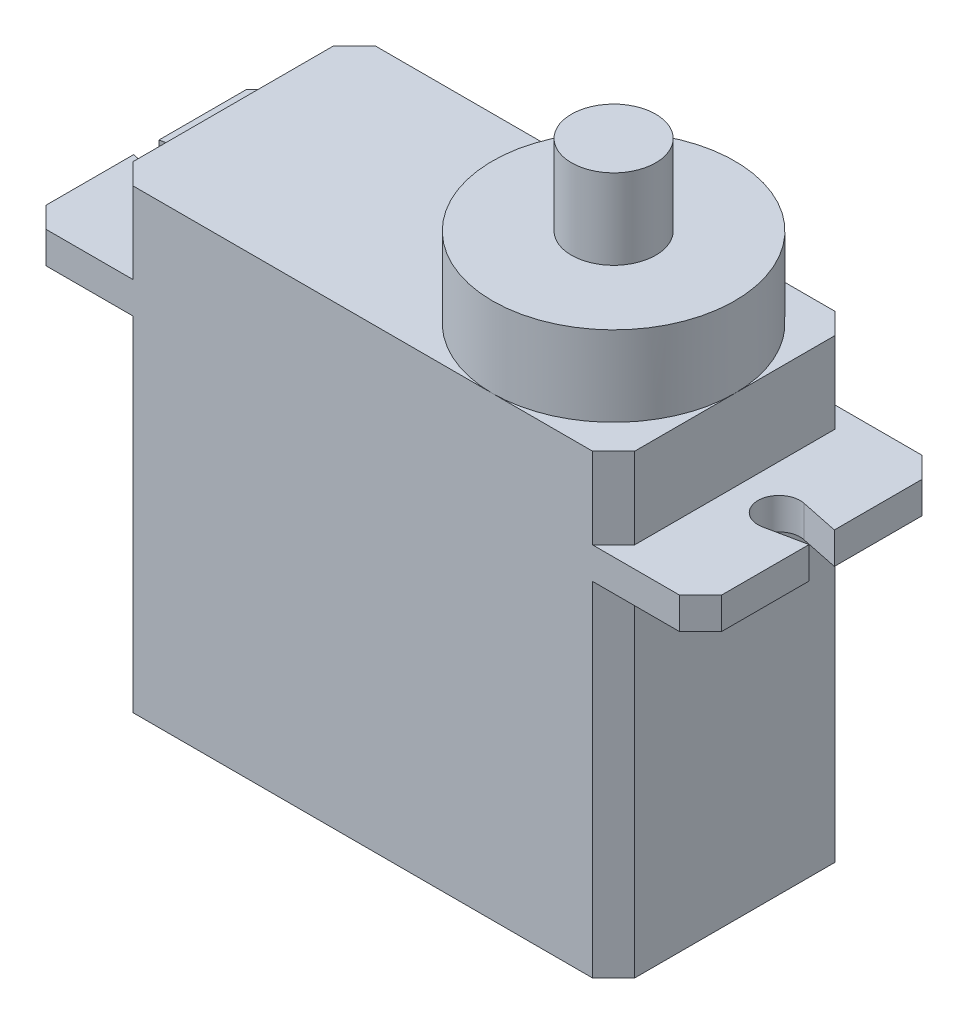
ISO-10303-21;
HEADER;
FILE_DESCRIPTION(('STEP AP214'),'2;1');
FILE_NAME('part.step','',(''),(''),'','','');
FILE_SCHEMA(('AUTOMOTIVE_DESIGN { 1 0 10303 214 1 1 1 1 }'));
ENDSEC;
DATA;
#1=APPLICATION_CONTEXT('core data for automotive mechanical design processes');
#2=APPLICATION_PROTOCOL_DEFINITION('international standard','automotive_design',2000,#1);
#3=PRODUCT_CONTEXT('',#1,'mechanical');
#4=PRODUCT('Part','Part','',(#3));
#5=PRODUCT_RELATED_PRODUCT_CATEGORY('part','',(#4));
#6=PRODUCT_DEFINITION_FORMATION('','',#4);
#7=PRODUCT_DEFINITION_CONTEXT('part definition',#1,'design');
#8=PRODUCT_DEFINITION('design','',#6,#7);
#9=PRODUCT_DEFINITION_SHAPE('','',#8);
#10=(LENGTH_UNIT() NAMED_UNIT(*) SI_UNIT(.MILLI.,.METRE.));
#11=(NAMED_UNIT(*) PLANE_ANGLE_UNIT() SI_UNIT($,.RADIAN.));
#12=(NAMED_UNIT(*) SI_UNIT($,.STERADIAN.) SOLID_ANGLE_UNIT());
#13=UNCERTAINTY_MEASURE_WITH_UNIT(LENGTH_MEASURE(1.E-05),#10,'distance_accuracy_value','');
#14=(GEOMETRIC_REPRESENTATION_CONTEXT(3) GLOBAL_UNCERTAINTY_ASSIGNED_CONTEXT((#13)) GLOBAL_UNIT_ASSIGNED_CONTEXT((#10,
#11,#12)) REPRESENTATION_CONTEXT('',''));
#15=CARTESIAN_POINT('',(0.,0.,0.));
#16=DIRECTION('',(0.,0.,1.));
#17=DIRECTION('',(1.,0.,0.));
#18=AXIS2_PLACEMENT_3D('',#15,#16,#17);
#19=CARTESIAN_POINT('',(-10.9,21.65,-5.75));
#20=DIRECTION('',(0.707106781186547,0.,0.707106781186548));
#21=DIRECTION('',(0.707106781186548,0.,-0.707106781186547));
#22=AXIS2_PLACEMENT_3D('',#19,#20,#21);
#23=PLANE('',#22);
#24=DIRECTION('',(-0.707106781186548,0.,0.707106781186547));
#25=VECTOR('',#24,1.);
#26=CARTESIAN_POINT('',(-8.32499999999999,16.3,-8.325));
#27=LINE('',#26,#25);
#28=CARTESIAN_POINT('',(-10.9,16.3,-5.75));
#29=VERTEX_POINT('',#28);
#30=CARTESIAN_POINT('',(-11.9,16.3,-4.75));
#31=VERTEX_POINT('',#30);
#32=EDGE_CURVE('E324',#29,#31,#27,.T.);
#33=ORIENTED_EDGE('',*,*,#32,.F.);
#34=DIRECTION('',(0.,-1.,0.));
#35=VECTOR('',#34,1.);
#36=CARTESIAN_POINT('',(-10.9,21.65,-5.75));
#37=LINE('',#36,#35);
#38=CARTESIAN_POINT('',(-10.9,0.,-5.75));
#39=VERTEX_POINT('',#38);
#40=EDGE_CURVE('E462',#29,#39,#37,.T.);
#41=ORIENTED_EDGE('',*,*,#40,.T.);
#42=DIRECTION('',(-0.707106781186548,0.,0.707106781186547));
#43=VECTOR('',#42,1.);
#44=CARTESIAN_POINT('',(-10.9,0.,-5.75));
#45=LINE('',#44,#43);
#46=CARTESIAN_POINT('',(-11.9,0.,-4.75));
#47=VERTEX_POINT('',#46);
#48=EDGE_CURVE('E463',#39,#47,#45,.T.);
#49=ORIENTED_EDGE('',*,*,#48,.T.);
#50=DIRECTION('',(0.,-1.,0.));
#51=VECTOR('',#50,1.);
#52=CARTESIAN_POINT('',(-11.9,21.65,-4.75));
#53=LINE('',#52,#51);
#54=EDGE_CURVE('E42',#31,#47,#53,.T.);
#55=ORIENTED_EDGE('',*,*,#54,.F.);
#56=EDGE_LOOP('',(#33,#41,#49,#55));
#57=FACE_BOUND('',#56,.T.);
#58=ADVANCED_FACE('F33',(#57),#23,.F.);
#59=CARTESIAN_POINT('',(-11.9,21.65,-4.75));
#60=DIRECTION('',(1.,0.,0.));
#61=DIRECTION('',(0.,0.,-1.));
#62=AXIS2_PLACEMENT_3D('',#59,#60,#61);
#63=PLANE('',#62);
#64=DIRECTION('',(0.,0.,1.));
#65=VECTOR('',#64,1.);
#66=CARTESIAN_POINT('',(-11.9,16.3,0.));
#67=LINE('',#66,#65);
#68=CARTESIAN_POINT('',(-11.9,16.3,4.75));
#69=VERTEX_POINT('',#68);
#70=EDGE_CURVE('E49',#31,#69,#67,.T.);
#71=ORIENTED_EDGE('',*,*,#70,.F.);
#72=ORIENTED_EDGE('',*,*,#54,.T.);
#73=DIRECTION('',(0.,0.,1.));
#74=VECTOR('',#73,1.);
#75=CARTESIAN_POINT('',(-11.9,0.,-4.75));
#76=LINE('',#75,#74);
#77=CARTESIAN_POINT('',(-11.9,0.,4.75));
#78=VERTEX_POINT('',#77);
#79=EDGE_CURVE('E466',#47,#78,#76,.T.);
#80=ORIENTED_EDGE('',*,*,#79,.T.);
#81=DIRECTION('',(0.,-1.,0.));
#82=VECTOR('',#81,1.);
#83=CARTESIAN_POINT('',(-11.9,21.65,4.75));
#84=LINE('',#83,#82);
#85=EDGE_CURVE('E508',#69,#78,#84,.T.);
#86=ORIENTED_EDGE('',*,*,#85,.F.);
#87=EDGE_LOOP('',(#71,#72,#80,#86));
#88=FACE_BOUND('',#87,.T.);
#89=ADVANCED_FACE('F520',(#88),#63,.F.);
#90=CARTESIAN_POINT('',(-11.9,21.65,4.75));
#91=DIRECTION('',(0.707106781186547,0.,-0.707106781186548));
#92=DIRECTION('',(-0.707106781186548,0.,-0.707106781186547));
#93=AXIS2_PLACEMENT_3D('',#90,#91,#92);
#94=PLANE('',#93);
#95=DIRECTION('',(0.707106781186548,0.,0.707106781186547));
#96=VECTOR('',#95,1.);
#97=CARTESIAN_POINT('',(-8.325,16.3,8.325));
#98=LINE('',#97,#96);
#99=CARTESIAN_POINT('',(-10.9,16.3,5.75));
#100=VERTEX_POINT('',#99);
#101=EDGE_CURVE('E320',#69,#100,#98,.T.);
#102=ORIENTED_EDGE('',*,*,#101,.F.);
#103=ORIENTED_EDGE('',*,*,#85,.T.);
#104=DIRECTION('',(0.707106781186548,0.,0.707106781186547));
#105=VECTOR('',#104,1.);
#106=CARTESIAN_POINT('',(-11.9,0.,4.75));
#107=LINE('',#106,#105);
#108=CARTESIAN_POINT('',(-10.9,0.,5.75));
#109=VERTEX_POINT('',#108);
#110=EDGE_CURVE('E469',#78,#109,#107,.T.);
#111=ORIENTED_EDGE('',*,*,#110,.T.);
#112=DIRECTION('',(0.,-1.,0.));
#113=VECTOR('',#112,1.);
#114=CARTESIAN_POINT('',(-10.9,21.65,5.75));
#115=LINE('',#114,#113);
#116=EDGE_CURVE('E504',#100,#109,#115,.T.);
#117=ORIENTED_EDGE('',*,*,#116,.F.);
#118=EDGE_LOOP('',(#102,#103,#111,#117));
#119=FACE_BOUND('',#118,.T.);
#120=ADVANCED_FACE('F516',(#119),#94,.F.);
#121=CARTESIAN_POINT('',(11.9,21.65,4.75));
#122=DIRECTION('',(0.707106781186547,0.,0.707106781186548));
#123=DIRECTION('',(0.707106781186548,0.,-0.707106781186547));
#124=AXIS2_PLACEMENT_3D('',#121,#122,#123);
#125=PLANE('',#124);
#126=DIRECTION('',(0.,-1.,0.));
#127=VECTOR('',#126,1.);
#128=CARTESIAN_POINT('',(11.9,21.65,4.75));
#129=LINE('',#128,#127);
#130=CARTESIAN_POINT('',(11.9,16.3,4.75));
#131=VERTEX_POINT('',#130);
#132=CARTESIAN_POINT('',(11.9,0.,4.75));
#133=VERTEX_POINT('',#132);
#134=EDGE_CURVE('E496',#131,#133,#129,.T.);
#135=ORIENTED_EDGE('',*,*,#134,.F.);
#136=DIRECTION('',(-0.707106781186548,0.,0.707106781186547));
#137=VECTOR('',#136,1.);
#138=CARTESIAN_POINT('',(8.325,16.3,8.32500000000001));
#139=LINE('',#138,#137);
#140=CARTESIAN_POINT('',(10.9,16.3,5.75));
#141=VERTEX_POINT('',#140);
#142=EDGE_CURVE('E395',#131,#141,#139,.T.);
#143=ORIENTED_EDGE('',*,*,#142,.T.);
#144=DIRECTION('',(0.,-1.,0.));
#145=VECTOR('',#144,1.);
#146=CARTESIAN_POINT('',(10.9,21.65,5.75));
#147=LINE('',#146,#145);
#148=CARTESIAN_POINT('',(10.9,0.,5.75));
#149=VERTEX_POINT('',#148);
#150=EDGE_CURVE('E500',#141,#149,#147,.T.);
#151=ORIENTED_EDGE('',*,*,#150,.T.);
#152=DIRECTION('',(-0.707106781186548,0.,0.707106781186547));
#153=VECTOR('',#152,1.);
#154=CARTESIAN_POINT('',(11.9,0.,4.75));
#155=LINE('',#154,#153);
#156=EDGE_CURVE('E475',#133,#149,#155,.T.);
#157=ORIENTED_EDGE('',*,*,#156,.F.);
#158=EDGE_LOOP('',(#135,#143,#151,#157));
#159=FACE_BOUND('',#158,.T.);
#160=ADVANCED_FACE('F549',(#159),#125,.T.);
#161=CARTESIAN_POINT('',(11.9,21.65,-4.75));
#162=DIRECTION('',(1.,0.,0.));
#163=DIRECTION('',(0.,0.,-1.));
#164=AXIS2_PLACEMENT_3D('',#161,#162,#163);
#165=PLANE('',#164);
#166=DIRECTION('',(0.,-1.,0.));
#167=VECTOR('',#166,1.);
#168=CARTESIAN_POINT('',(11.9,21.65,-4.75));
#169=LINE('',#168,#167);
#170=CARTESIAN_POINT('',(11.9,16.3,-4.75));
#171=VERTEX_POINT('',#170);
#172=CARTESIAN_POINT('',(11.9,0.,-4.75));
#173=VERTEX_POINT('',#172);
#174=EDGE_CURVE('E492',#171,#173,#169,.T.);
#175=ORIENTED_EDGE('',*,*,#174,.F.);
#176=DIRECTION('',(0.,0.,1.));
#177=VECTOR('',#176,1.);
#178=CARTESIAN_POINT('',(11.9,16.3,0.));
#179=LINE('',#178,#177);
#180=EDGE_CURVE('E392',#171,#131,#179,.T.);
#181=ORIENTED_EDGE('',*,*,#180,.T.);
#182=ORIENTED_EDGE('',*,*,#134,.T.);
#183=DIRECTION('',(0.,0.,1.));
#184=VECTOR('',#183,1.);
#185=CARTESIAN_POINT('',(11.9,0.,-4.75));
#186=LINE('',#185,#184);
#187=EDGE_CURVE('E478',#173,#133,#186,.T.);
#188=ORIENTED_EDGE('',*,*,#187,.F.);
#189=EDGE_LOOP('',(#175,#181,#182,#188));
#190=FACE_BOUND('',#189,.T.);
#191=ADVANCED_FACE('F553',(#190),#165,.T.);
#192=CARTESIAN_POINT('',(10.9,21.65,-5.75));
#193=DIRECTION('',(0.707106781186547,0.,-0.707106781186548));
#194=DIRECTION('',(-0.707106781186548,0.,-0.707106781186547));
#195=AXIS2_PLACEMENT_3D('',#192,#193,#194);
#196=PLANE('',#195);
#197=DIRECTION('',(0.,-1.,0.));
#198=VECTOR('',#197,1.);
#199=CARTESIAN_POINT('',(10.9,21.65,-5.75));
#200=LINE('',#199,#198);
#201=CARTESIAN_POINT('',(10.9,16.3,-5.75));
#202=VERTEX_POINT('',#201);
#203=CARTESIAN_POINT('',(10.9,0.,-5.75));
#204=VERTEX_POINT('',#203);
#205=EDGE_CURVE('E488',#202,#204,#200,.T.);
#206=ORIENTED_EDGE('',*,*,#205,.F.);
#207=DIRECTION('',(0.707106781186548,0.,0.707106781186547));
#208=VECTOR('',#207,1.);
#209=CARTESIAN_POINT('',(8.325,16.3,-8.325));
#210=LINE('',#209,#208);
#211=EDGE_CURVE('E389',#202,#171,#210,.T.);
#212=ORIENTED_EDGE('',*,*,#211,.T.);
#213=ORIENTED_EDGE('',*,*,#174,.T.);
#214=DIRECTION('',(0.707106781186548,0.,0.707106781186547));
#215=VECTOR('',#214,1.);
#216=CARTESIAN_POINT('',(10.9,0.,-5.75));
#217=LINE('',#216,#215);
#218=EDGE_CURVE('E481',#204,#173,#217,.T.);
#219=ORIENTED_EDGE('',*,*,#218,.F.);
#220=EDGE_LOOP('',(#206,#212,#213,#219));
#221=FACE_BOUND('',#220,.T.);
#222=ADVANCED_FACE('F543',(#221),#196,.T.);
#223=CARTESIAN_POINT('',(0.,21.65,0.));
#224=DIRECTION('',(0.,1.,0.));
#225=DIRECTION('',(0.,0.,1.));
#226=AXIS2_PLACEMENT_3D('',#223,#224,#225);
#227=PLANE('',#226);
#228=DIRECTION('',(1.,0.,0.));
#229=VECTOR('',#228,1.);
#230=CARTESIAN_POINT('',(-10.9,21.65,5.75));
#231=LINE('',#230,#229);
#232=CARTESIAN_POINT('',(-10.9,21.65,5.75));
#233=VERTEX_POINT('',#232);
#234=CARTESIAN_POINT('',(6.15,21.65,5.75));
#235=VERTEX_POINT('',#234);
#236=EDGE_CURVE('E445',#233,#235,#231,.T.);
#237=ORIENTED_EDGE('',*,*,#236,.T.);
#238=CARTESIAN_POINT('',(6.15,21.65,0.));
#239=DIRECTION('',(0.,1.,0.));
#240=DIRECTION('',(0.,0.,1.));
#241=AXIS2_PLACEMENT_3D('',#238,#239,#240);
#242=CIRCLE('',#241,5.75);
#243=CARTESIAN_POINT('',(6.15,21.65,-5.75));
#244=VERTEX_POINT('',#243);
#245=EDGE_CURVE('E435',#235,#244,#242,.F.);
#246=ORIENTED_EDGE('',*,*,#245,.T.);
#247=DIRECTION('',(1.,0.,0.));
#248=VECTOR('',#247,1.);
#249=CARTESIAN_POINT('',(-10.9,21.65,-5.75));
#250=LINE('',#249,#248);
#251=CARTESIAN_POINT('',(-10.9,21.65,-5.75));
#252=VERTEX_POINT('',#251);
#253=EDGE_CURVE('E459',#252,#244,#250,.T.);
#254=ORIENTED_EDGE('',*,*,#253,.F.);
#255=DIRECTION('',(-0.707106781186548,0.,0.707106781186547));
#256=VECTOR('',#255,1.);
#257=CARTESIAN_POINT('',(-10.9,21.65,-5.75));
#258=LINE('',#257,#256);
#259=CARTESIAN_POINT('',(-11.9,21.65,-4.75));
#260=VERTEX_POINT('',#259);
#261=EDGE_CURVE('E436',#252,#260,#258,.T.);
#262=ORIENTED_EDGE('',*,*,#261,.T.);
#263=DIRECTION('',(0.,0.,1.));
#264=VECTOR('',#263,1.);
#265=CARTESIAN_POINT('',(-11.9,21.65,-4.75));
#266=LINE('',#265,#264);
#267=CARTESIAN_POINT('',(-11.9,21.65,4.75));
#268=VERTEX_POINT('',#267);
#269=EDGE_CURVE('E439',#260,#268,#266,.T.);
#270=ORIENTED_EDGE('',*,*,#269,.T.);
#271=DIRECTION('',(0.707106781186548,0.,0.707106781186547));
#272=VECTOR('',#271,1.);
#273=CARTESIAN_POINT('',(-11.9,21.65,4.75));
#274=LINE('',#273,#272);
#275=EDGE_CURVE('E442',#268,#233,#274,.T.);
#276=ORIENTED_EDGE('',*,*,#275,.T.);
#277=EDGE_LOOP('',(#237,#246,#254,#262,#270,#276));
#278=FACE_BOUND('',#277,.T.);
#279=ADVANCED_FACE('F561',(#278),#227,.T.);
#280=CARTESIAN_POINT('',(10.9,21.65,-5.75));
#281=VERTEX_POINT('',#280);
#282=EDGE_CURVE('E458',#244,#281,#250,.T.);
#283=ORIENTED_EDGE('',*,*,#282,.F.);
#284=CARTESIAN_POINT('',(11.9,21.65,0.));
#285=VERTEX_POINT('',#284);
#286=EDGE_CURVE('E434',#244,#285,#242,.F.);
#287=ORIENTED_EDGE('',*,*,#286,.T.);
#288=DIRECTION('',(0.,0.,1.));
#289=VECTOR('',#288,1.);
#290=CARTESIAN_POINT('',(11.9,21.65,-4.75));
#291=LINE('',#290,#289);
#292=CARTESIAN_POINT('',(11.9,21.65,-4.75));
#293=VERTEX_POINT('',#292);
#294=EDGE_CURVE('E452',#293,#285,#291,.T.);
#295=ORIENTED_EDGE('',*,*,#294,.F.);
#296=DIRECTION('',(0.707106781186548,0.,0.707106781186547));
#297=VECTOR('',#296,1.);
#298=CARTESIAN_POINT('',(10.9,21.65,-5.75));
#299=LINE('',#298,#297);
#300=EDGE_CURVE('E455',#281,#293,#299,.T.);
#301=ORIENTED_EDGE('',*,*,#300,.F.);
#302=EDGE_LOOP('',(#283,#287,#295,#301));
#303=FACE_BOUND('',#302,.T.);
#304=ADVANCED_FACE('F574',(#303),#227,.T.);
#305=CARTESIAN_POINT('',(-10.9,17.8,-5.75));
#306=VERTEX_POINT('',#305);
#307=EDGE_CURVE('E486',#252,#306,#37,.T.);
#308=ORIENTED_EDGE('',*,*,#307,.T.);
#309=DIRECTION('',(-0.707106781186548,0.,0.707106781186547));
#310=VECTOR('',#309,1.);
#311=CARTESIAN_POINT('',(-8.32499999999999,17.8,-8.325));
#312=LINE('',#311,#310);
#313=CARTESIAN_POINT('',(-11.9,17.8,-4.75));
#314=VERTEX_POINT('',#313);
#315=EDGE_CURVE('E57',#306,#314,#312,.T.);
#316=ORIENTED_EDGE('',*,*,#315,.T.);
#317=EDGE_CURVE('E11',#260,#314,#53,.T.);
#318=ORIENTED_EDGE('',*,*,#317,.F.);
#319=ORIENTED_EDGE('',*,*,#261,.F.);
#320=EDGE_LOOP('',(#308,#316,#318,#319));
#321=FACE_BOUND('',#320,.T.);
#322=ADVANCED_FACE('F35',(#321),#23,.F.);
#323=ORIENTED_EDGE('',*,*,#317,.T.);
#324=DIRECTION('',(0.,0.,1.));
#325=VECTOR('',#324,1.);
#326=CARTESIAN_POINT('',(-11.9,17.8,0.));
#327=LINE('',#326,#325);
#328=CARTESIAN_POINT('',(-11.9,17.8,4.75));
#329=VERTEX_POINT('',#328);
#330=EDGE_CURVE('E294',#314,#329,#327,.T.);
#331=ORIENTED_EDGE('',*,*,#330,.T.);
#332=EDGE_CURVE('E509',#268,#329,#84,.T.);
#333=ORIENTED_EDGE('',*,*,#332,.F.);
#334=ORIENTED_EDGE('',*,*,#269,.F.);
#335=EDGE_LOOP('',(#323,#331,#333,#334));
#336=FACE_BOUND('',#335,.T.);
#337=ADVANCED_FACE('F572',(#336),#63,.F.);
#338=ORIENTED_EDGE('',*,*,#332,.T.);
#339=DIRECTION('',(0.707106781186548,0.,0.707106781186547));
#340=VECTOR('',#339,1.);
#341=CARTESIAN_POINT('',(-8.325,17.8,8.325));
#342=LINE('',#341,#340);
#343=CARTESIAN_POINT('',(-10.9,17.8,5.75));
#344=VERTEX_POINT('',#343);
#345=EDGE_CURVE('E292',#329,#344,#342,.T.);
#346=ORIENTED_EDGE('',*,*,#345,.T.);
#347=EDGE_CURVE('E505',#233,#344,#115,.T.);
#348=ORIENTED_EDGE('',*,*,#347,.F.);
#349=ORIENTED_EDGE('',*,*,#275,.F.);
#350=EDGE_LOOP('',(#338,#346,#348,#349));
#351=FACE_BOUND('',#350,.T.);
#352=ADVANCED_FACE('F579',(#351),#94,.F.);
#353=CARTESIAN_POINT('',(-10.9,21.65,5.75));
#354=DIRECTION('',(0.,0.,-1.));
#355=DIRECTION('',(-1.,0.,0.));
#356=AXIS2_PLACEMENT_3D('',#353,#354,#355);
#357=PLANE('',#356);
#358=DIRECTION('',(1.,0.,0.));
#359=VECTOR('',#358,1.);
#360=CARTESIAN_POINT('',(-10.9,0.,5.75));
#361=LINE('',#360,#359);
#362=EDGE_CURVE('E472',#109,#149,#361,.T.);
#363=ORIENTED_EDGE('',*,*,#362,.T.);
#364=ORIENTED_EDGE('',*,*,#150,.F.);
#365=DIRECTION('',(-1.,0.,0.));
#366=VECTOR('',#365,1.);
#367=CARTESIAN_POINT('',(0.,16.3,5.75));
#368=LINE('',#367,#366);
#369=CARTESIAN_POINT('',(15.025,16.3,5.75));
#370=VERTEX_POINT('',#369);
#371=EDGE_CURVE('E398',#370,#141,#368,.T.);
#372=ORIENTED_EDGE('',*,*,#371,.F.);
#373=DIRECTION('',(0.,-1.,0.));
#374=VECTOR('',#373,1.);
#375=CARTESIAN_POINT('',(15.025,17.8,5.75));
#376=LINE('',#375,#374);
#377=CARTESIAN_POINT('',(15.025,17.8,5.75));
#378=VERTEX_POINT('',#377);
#379=EDGE_CURVE('E413',#378,#370,#376,.T.);
#380=ORIENTED_EDGE('',*,*,#379,.F.);
#381=DIRECTION('',(-1.,0.,0.));
#382=VECTOR('',#381,1.);
#383=CARTESIAN_POINT('',(0.,17.8,5.75));
#384=LINE('',#383,#382);
#385=CARTESIAN_POINT('',(10.9,17.8,5.75));
#386=VERTEX_POINT('',#385);
#387=EDGE_CURVE('E366',#378,#386,#384,.T.);
#388=ORIENTED_EDGE('',*,*,#387,.T.);
#389=CARTESIAN_POINT('',(10.9,21.65,5.75));
#390=VERTEX_POINT('',#389);
#391=EDGE_CURVE('E501',#390,#386,#147,.T.);
#392=ORIENTED_EDGE('',*,*,#391,.F.);
#393=EDGE_CURVE('E444',#235,#390,#231,.T.);
#394=ORIENTED_EDGE('',*,*,#393,.F.);
#395=ORIENTED_EDGE('',*,*,#236,.F.);
#396=ORIENTED_EDGE('',*,*,#347,.T.);
#397=DIRECTION('',(-1.,0.,0.));
#398=VECTOR('',#397,1.);
#399=CARTESIAN_POINT('',(0.,17.8,5.75));
#400=LINE('',#399,#398);
#401=CARTESIAN_POINT('',(-15.025,17.8,5.75));
#402=VERTEX_POINT('',#401);
#403=EDGE_CURVE('E289',#344,#402,#400,.T.);
#404=ORIENTED_EDGE('',*,*,#403,.T.);
#405=DIRECTION('',(0.,-1.,0.));
#406=VECTOR('',#405,1.);
#407=CARTESIAN_POINT('',(-15.025,17.8,5.75));
#408=LINE('',#407,#406);
#409=CARTESIAN_POINT('',(-15.025,16.3,5.75));
#410=VERTEX_POINT('',#409);
#411=EDGE_CURVE('E342',#402,#410,#408,.T.);
#412=ORIENTED_EDGE('',*,*,#411,.T.);
#413=DIRECTION('',(-1.,0.,0.));
#414=VECTOR('',#413,1.);
#415=CARTESIAN_POINT('',(0.,16.3,5.75));
#416=LINE('',#415,#414);
#417=EDGE_CURVE('E317',#100,#410,#416,.T.);
#418=ORIENTED_EDGE('',*,*,#417,.F.);
#419=ORIENTED_EDGE('',*,*,#116,.T.);
#420=EDGE_LOOP('',(#363,#364,#372,#380,#388,#392,#394,#395,#396,#404,#412,#418,#419));
#421=FACE_BOUND('',#420,.T.);
#422=ADVANCED_FACE('F527',(#421),#357,.F.);
#423=DIRECTION('',(-0.707106781186548,0.,0.707106781186547));
#424=VECTOR('',#423,1.);
#425=CARTESIAN_POINT('',(8.325,17.8,8.32500000000001));
#426=LINE('',#425,#424);
#427=CARTESIAN_POINT('',(11.9,17.8,4.75));
#428=VERTEX_POINT('',#427);
#429=EDGE_CURVE('E364',#428,#386,#426,.T.);
#430=ORIENTED_EDGE('',*,*,#429,.F.);
#431=CARTESIAN_POINT('',(11.9,21.65,4.75));
#432=VERTEX_POINT('',#431);
#433=EDGE_CURVE('E497',#432,#428,#129,.T.);
#434=ORIENTED_EDGE('',*,*,#433,.F.);
#435=DIRECTION('',(-0.707106781186548,0.,0.707106781186547));
#436=VECTOR('',#435,1.);
#437=CARTESIAN_POINT('',(11.9,21.65,4.75));
#438=LINE('',#437,#436);
#439=EDGE_CURVE('E448',#432,#390,#438,.T.);
#440=ORIENTED_EDGE('',*,*,#439,.T.);
#441=ORIENTED_EDGE('',*,*,#391,.T.);
#442=EDGE_LOOP('',(#430,#434,#440,#441));
#443=FACE_BOUND('',#442,.T.);
#444=ADVANCED_FACE('F565',(#443),#125,.T.);
#445=DIRECTION('',(0.,0.,1.));
#446=VECTOR('',#445,1.);
#447=CARTESIAN_POINT('',(11.9,17.8,0.));
#448=LINE('',#447,#446);
#449=CARTESIAN_POINT('',(11.9,17.8,-4.75));
#450=VERTEX_POINT('',#449);
#451=EDGE_CURVE('E362',#450,#428,#448,.T.);
#452=ORIENTED_EDGE('',*,*,#451,.F.);
#453=EDGE_CURVE('E493',#293,#450,#169,.T.);
#454=ORIENTED_EDGE('',*,*,#453,.F.);
#455=ORIENTED_EDGE('',*,*,#294,.T.);
#456=EDGE_CURVE('E451',#285,#432,#291,.T.);
#457=ORIENTED_EDGE('',*,*,#456,.T.);
#458=ORIENTED_EDGE('',*,*,#433,.T.);
#459=EDGE_LOOP('',(#452,#454,#455,#457,#458));
#460=FACE_BOUND('',#459,.T.);
#461=ADVANCED_FACE('F556',(#460),#165,.T.);
#462=DIRECTION('',(0.707106781186548,0.,0.707106781186547));
#463=VECTOR('',#462,1.);
#464=CARTESIAN_POINT('',(8.325,17.8,-8.325));
#465=LINE('',#464,#463);
#466=CARTESIAN_POINT('',(10.9,17.8,-5.75));
#467=VERTEX_POINT('',#466);
#468=EDGE_CURVE('E360',#467,#450,#465,.T.);
#469=ORIENTED_EDGE('',*,*,#468,.F.);
#470=EDGE_CURVE('E489',#281,#467,#200,.T.);
#471=ORIENTED_EDGE('',*,*,#470,.F.);
#472=ORIENTED_EDGE('',*,*,#300,.T.);
#473=ORIENTED_EDGE('',*,*,#453,.T.);
#474=EDGE_LOOP('',(#469,#471,#472,#473));
#475=FACE_BOUND('',#474,.T.);
#476=ADVANCED_FACE('F563',(#475),#196,.T.);
#477=CARTESIAN_POINT('',(-10.9,21.65,-5.75));
#478=DIRECTION('',(0.,0.,-1.));
#479=DIRECTION('',(-1.,0.,0.));
#480=AXIS2_PLACEMENT_3D('',#477,#478,#479);
#481=PLANE('',#480);
#482=ORIENTED_EDGE('',*,*,#253,.T.);
#483=ORIENTED_EDGE('',*,*,#282,.T.);
#484=ORIENTED_EDGE('',*,*,#470,.T.);
#485=DIRECTION('',(1.,0.,0.));
#486=VECTOR('',#485,1.);
#487=CARTESIAN_POINT('',(0.,17.8,-5.75));
#488=LINE('',#487,#486);
#489=CARTESIAN_POINT('',(15.025,17.8,-5.75));
#490=VERTEX_POINT('',#489);
#491=EDGE_CURVE('E357',#467,#490,#488,.T.);
#492=ORIENTED_EDGE('',*,*,#491,.T.);
#493=DIRECTION('',(0.,-1.,0.));
#494=VECTOR('',#493,1.);
#495=CARTESIAN_POINT('',(15.025,17.8,-5.75));
#496=LINE('',#495,#494);
#497=CARTESIAN_POINT('',(15.025,16.3,-5.75));
#498=VERTEX_POINT('',#497);
#499=EDGE_CURVE('E415',#490,#498,#496,.T.);
#500=ORIENTED_EDGE('',*,*,#499,.T.);
#501=DIRECTION('',(1.,0.,0.));
#502=VECTOR('',#501,1.);
#503=CARTESIAN_POINT('',(0.,16.3,-5.75));
#504=LINE('',#503,#502);
#505=EDGE_CURVE('E386',#202,#498,#504,.T.);
#506=ORIENTED_EDGE('',*,*,#505,.F.);
#507=ORIENTED_EDGE('',*,*,#205,.T.);
#508=DIRECTION('',(1.,0.,0.));
#509=VECTOR('',#508,1.);
#510=CARTESIAN_POINT('',(-10.9,0.,-5.75));
#511=LINE('',#510,#509);
#512=EDGE_CURVE('E440',#39,#204,#511,.T.);
#513=ORIENTED_EDGE('',*,*,#512,.F.);
#514=ORIENTED_EDGE('',*,*,#40,.F.);
#515=DIRECTION('',(1.,0.,0.));
#516=VECTOR('',#515,1.);
#517=CARTESIAN_POINT('',(0.,16.3,-5.75));
#518=LINE('',#517,#516);
#519=CARTESIAN_POINT('',(-15.025,16.3,-5.74999999999999));
#520=VERTEX_POINT('',#519);
#521=EDGE_CURVE('E327',#520,#29,#518,.T.);
#522=ORIENTED_EDGE('',*,*,#521,.F.);
#523=DIRECTION('',(0.,-1.,0.));
#524=VECTOR('',#523,1.);
#525=CARTESIAN_POINT('',(-15.025,17.8,-5.74999999999999));
#526=LINE('',#525,#524);
#527=CARTESIAN_POINT('',(-15.025,17.8,-5.74999999999999));
#528=VERTEX_POINT('',#527);
#529=EDGE_CURVE('E340',#528,#520,#526,.T.);
#530=ORIENTED_EDGE('',*,*,#529,.F.);
#531=DIRECTION('',(1.,0.,0.));
#532=VECTOR('',#531,1.);
#533=CARTESIAN_POINT('',(0.,17.8,-5.75));
#534=LINE('',#533,#532);
#535=EDGE_CURVE('E297',#528,#306,#534,.T.);
#536=ORIENTED_EDGE('',*,*,#535,.T.);
#537=ORIENTED_EDGE('',*,*,#307,.F.);
#538=EDGE_LOOP('',(#482,#483,#484,#492,#500,#506,#507,#513,#514,#522,#530,#536,#537));
#539=FACE_BOUND('',#538,.T.);
#540=ADVANCED_FACE('F539',(#539),#481,.T.);
#541=ORIENTED_EDGE('',*,*,#456,.F.);
#542=EDGE_CURVE('E431',#285,#235,#242,.F.);
#543=ORIENTED_EDGE('',*,*,#542,.T.);
#544=ORIENTED_EDGE('',*,*,#393,.T.);
#545=ORIENTED_EDGE('',*,*,#439,.F.);
#546=EDGE_LOOP('',(#541,#543,#544,#545));
#547=FACE_BOUND('',#546,.T.);
#548=ADVANCED_FACE('F583',(#547),#227,.T.);
#549=CARTESIAN_POINT('',(0.,0.,0.));
#550=DIRECTION('',(0.,1.,0.));
#551=DIRECTION('',(0.,0.,1.));
#552=AXIS2_PLACEMENT_3D('',#549,#550,#551);
#553=PLANE('',#552);
#554=ORIENTED_EDGE('',*,*,#156,.T.);
#555=ORIENTED_EDGE('',*,*,#362,.F.);
#556=ORIENTED_EDGE('',*,*,#110,.F.);
#557=ORIENTED_EDGE('',*,*,#79,.F.);
#558=ORIENTED_EDGE('',*,*,#48,.F.);
#559=ORIENTED_EDGE('',*,*,#512,.T.);
#560=ORIENTED_EDGE('',*,*,#218,.T.);
#561=ORIENTED_EDGE('',*,*,#187,.T.);
#562=EDGE_LOOP('',(#554,#555,#556,#557,#558,#559,#560,#561));
#563=FACE_BOUND('',#562,.T.);
#564=ADVANCED_FACE('F523',(#563),#553,.F.);
#565=CARTESIAN_POINT('',(6.15,25.45,0.));
#566=DIRECTION('',(0.,-1.,0.));
#567=DIRECTION('',(0.,0.,-1.));
#568=AXIS2_PLACEMENT_3D('',#565,#566,#567);
#569=CYLINDRICAL_SURFACE('',#568,5.75);
#570=ORIENTED_EDGE('',*,*,#245,.F.);
#571=ORIENTED_EDGE('',*,*,#542,.F.);
#572=ORIENTED_EDGE('',*,*,#286,.F.);
#573=EDGE_LOOP('',(#570,#571,#572));
#574=FACE_BOUND('',#573,.T.);
#575=CARTESIAN_POINT('',(6.15,25.45,0.));
#576=DIRECTION('',(0.,1.,0.));
#577=DIRECTION('',(0.,0.,1.));
#578=AXIS2_PLACEMENT_3D('',#575,#576,#577);
#579=CIRCLE('',#578,5.75);
#580=CARTESIAN_POINT('',(6.15,25.45,5.75));
#581=VERTEX_POINT('',#580);
#582=EDGE_CURVE('E428',#581,#581,#579,.T.);
#583=ORIENTED_EDGE('',*,*,#582,.F.);
#584=EDGE_LOOP('',(#583));
#585=FACE_BOUND('',#584,.T.);
#586=ADVANCED_FACE('F664',(#574,#585),#569,.T.);
#587=CARTESIAN_POINT('',(6.15,25.45,0.));
#588=DIRECTION('',(0.,1.,0.));
#589=DIRECTION('',(0.,0.,1.));
#590=AXIS2_PLACEMENT_3D('',#587,#588,#589);
#591=PLANE('',#590);
#592=CARTESIAN_POINT('',(6.15,25.45,0.));
#593=DIRECTION('',(0.,1.,0.));
#594=DIRECTION('',(0.,0.,1.));
#595=AXIS2_PLACEMENT_3D('',#592,#593,#594);
#596=CIRCLE('',#595,2.);
#597=CARTESIAN_POINT('',(6.15,25.45,2.));
#598=VERTEX_POINT('',#597);
#599=EDGE_CURVE('E37',#598,#598,#596,.F.);
#600=ORIENTED_EDGE('',*,*,#599,.T.);
#601=EDGE_LOOP('',(#600));
#602=FACE_BOUND('',#601,.T.);
#603=ORIENTED_EDGE('',*,*,#582,.T.);
#604=EDGE_LOOP('',(#603));
#605=FACE_BOUND('',#604,.T.);
#606=ADVANCED_FACE('F660',(#602,#605),#591,.T.);
#607=CARTESIAN_POINT('',(6.15,29.25,0.));
#608=DIRECTION('',(0.,-1.,0.));
#609=DIRECTION('',(0.,0.,-1.));
#610=AXIS2_PLACEMENT_3D('',#607,#608,#609);
#611=CYLINDRICAL_SURFACE('',#610,2.);
#612=ORIENTED_EDGE('',*,*,#599,.F.);
#613=EDGE_LOOP('',(#612));
#614=FACE_BOUND('',#613,.T.);
#615=CARTESIAN_POINT('',(6.15,29.25,0.));
#616=DIRECTION('',(0.,1.,0.));
#617=DIRECTION('',(0.,0.,1.));
#618=AXIS2_PLACEMENT_3D('',#615,#616,#617);
#619=CIRCLE('',#618,2.);
#620=CARTESIAN_POINT('',(6.15,29.25,2.));
#621=VERTEX_POINT('',#620);
#622=EDGE_CURVE('E425',#621,#621,#619,.T.);
#623=ORIENTED_EDGE('',*,*,#622,.F.);
#624=EDGE_LOOP('',(#623));
#625=FACE_BOUND('',#624,.T.);
#626=ADVANCED_FACE('F656',(#614,#625),#611,.T.);
#627=CARTESIAN_POINT('',(6.15,29.25,0.));
#628=DIRECTION('',(0.,1.,0.));
#629=DIRECTION('',(0.,0.,1.));
#630=AXIS2_PLACEMENT_3D('',#627,#628,#629);
#631=PLANE('',#630);
#632=ORIENTED_EDGE('',*,*,#622,.T.);
#633=EDGE_LOOP('',(#632));
#634=FACE_BOUND('',#633,.T.);
#635=ADVANCED_FACE('F652',(#634),#631,.T.);
#636=CARTESIAN_POINT('',(14.,17.8,0.));
#637=DIRECTION('',(0.,-1.,0.));
#638=DIRECTION('',(0.,0.,-1.));
#639=AXIS2_PLACEMENT_3D('',#636,#637,#638);
#640=CYLINDRICAL_SURFACE('',#639,1.);
#641=CARTESIAN_POINT('',(14.,16.3,0.));
#642=DIRECTION('',(0.,1.,0.));
#643=DIRECTION('',(0.,0.,1.));
#644=AXIS2_PLACEMENT_3D('',#641,#642,#643);
#645=CIRCLE('',#644,1.);
#646=CARTESIAN_POINT('',(14.2037460422391,16.3,-0.979023774109643));
#647=VERTEX_POINT('',#646);
#648=CARTESIAN_POINT('',(14.2037460422391,16.3,0.979023774109649));
#649=VERTEX_POINT('',#648);
#650=EDGE_CURVE('E264',#647,#649,#645,.T.);
#651=ORIENTED_EDGE('',*,*,#650,.F.);
#652=DIRECTION('',(0.,-1.,0.));
#653=VECTOR('',#652,1.);
#654=CARTESIAN_POINT('',(14.2037460422391,17.8,-0.979023774109643));
#655=LINE('',#654,#653);
#656=CARTESIAN_POINT('',(14.2037460422391,17.8,-0.979023774109643));
#657=VERTEX_POINT('',#656);
#658=EDGE_CURVE('E423',#657,#647,#655,.T.);
#659=ORIENTED_EDGE('',*,*,#658,.F.);
#660=CARTESIAN_POINT('',(14.,17.8,0.));
#661=DIRECTION('',(0.,1.,0.));
#662=DIRECTION('',(0.,0.,1.));
#663=AXIS2_PLACEMENT_3D('',#660,#661,#662);
#664=CIRCLE('',#663,1.);
#665=CARTESIAN_POINT('',(14.2037460422391,17.8,0.979023774109649));
#666=VERTEX_POINT('',#665);
#667=EDGE_CURVE('E347',#657,#666,#664,.T.);
#668=ORIENTED_EDGE('',*,*,#667,.T.);
#669=DIRECTION('',(0.,-1.,0.));
#670=VECTOR('',#669,1.);
#671=CARTESIAN_POINT('',(14.2037460422391,17.8,0.979023774109649));
#672=LINE('',#671,#670);
#673=EDGE_CURVE('E376',#666,#649,#672,.T.);
#674=ORIENTED_EDGE('',*,*,#673,.T.);
#675=EDGE_LOOP('',(#651,#659,#668,#674));
#676=FACE_BOUND('',#675,.T.);
#677=ADVANCED_FACE('F648',(#676),#640,.F.);
#678=CARTESIAN_POINT('',(0.784920338432559,17.8,-3.77163484336943));
#679=DIRECTION('',(0.203746042239115,0.,-0.979023774109647));
#680=DIRECTION('',(-0.979023774109647,0.,-0.203746042239115));
#681=AXIS2_PLACEMENT_3D('',#678,#679,#680);
#682=PLANE('',#681);
#683=DIRECTION('',(0.979023774109647,0.,0.203746042239115));
#684=VECTOR('',#683,1.);
#685=CARTESIAN_POINT('',(0.784920338432559,16.3,-3.77163484336943));
#686=LINE('',#685,#684);
#687=CARTESIAN_POINT('',(16.025,16.3,-0.6));
#688=VERTEX_POINT('',#687);
#689=EDGE_CURVE('E379',#647,#688,#686,.T.);
#690=ORIENTED_EDGE('',*,*,#689,.T.);
#691=DIRECTION('',(0.,-1.,0.));
#692=VECTOR('',#691,1.);
#693=CARTESIAN_POINT('',(16.025,17.8,-0.6));
#694=LINE('',#693,#692);
#695=CARTESIAN_POINT('',(16.025,17.8,-0.6));
#696=VERTEX_POINT('',#695);
#697=EDGE_CURVE('E420',#696,#688,#694,.T.);
#698=ORIENTED_EDGE('',*,*,#697,.F.);
#699=DIRECTION('',(0.979023774109647,0.,0.203746042239115));
#700=VECTOR('',#699,1.);
#701=CARTESIAN_POINT('',(0.784920338432559,17.8,-3.77163484336943));
#702=LINE('',#701,#700);
#703=EDGE_CURVE('E350',#657,#696,#702,.T.);
#704=ORIENTED_EDGE('',*,*,#703,.F.);
#705=ORIENTED_EDGE('',*,*,#658,.T.);
#706=EDGE_LOOP('',(#690,#698,#704,#705));
#707=FACE_BOUND('',#706,.T.);
#708=ADVANCED_FACE('F644',(#707),#682,.F.);
#709=CARTESIAN_POINT('',(16.025,17.8,0.));
#710=DIRECTION('',(-1.,0.,0.));
#711=DIRECTION('',(0.,0.,1.));
#712=AXIS2_PLACEMENT_3D('',#709,#710,#711);
#713=PLANE('',#712);
#714=DIRECTION('',(0.,0.,-1.));
#715=VECTOR('',#714,1.);
#716=CARTESIAN_POINT('',(16.025,16.3,0.));
#717=LINE('',#716,#715);
#718=CARTESIAN_POINT('',(16.025,16.3,-4.75));
#719=VERTEX_POINT('',#718);
#720=EDGE_CURVE('E381',#688,#719,#717,.T.);
#721=ORIENTED_EDGE('',*,*,#720,.T.);
#722=DIRECTION('',(0.,-1.,0.));
#723=VECTOR('',#722,1.);
#724=CARTESIAN_POINT('',(16.025,17.8,-4.75));
#725=LINE('',#724,#723);
#726=CARTESIAN_POINT('',(16.025,17.8,-4.75));
#727=VERTEX_POINT('',#726);
#728=EDGE_CURVE('E417',#727,#719,#725,.T.);
#729=ORIENTED_EDGE('',*,*,#728,.F.);
#730=DIRECTION('',(0.,0.,-1.));
#731=VECTOR('',#730,1.);
#732=CARTESIAN_POINT('',(16.025,17.8,0.));
#733=LINE('',#732,#731);
#734=EDGE_CURVE('E353',#696,#727,#733,.T.);
#735=ORIENTED_EDGE('',*,*,#734,.F.);
#736=ORIENTED_EDGE('',*,*,#697,.T.);
#737=EDGE_LOOP('',(#721,#729,#735,#736));
#738=FACE_BOUND('',#737,.T.);
#739=ADVANCED_FACE('F640',(#738),#713,.F.);
#740=CARTESIAN_POINT('',(10.3875,17.8,-10.3875));
#741=DIRECTION('',(-0.707106781186547,0.,0.707106781186548));
#742=DIRECTION('',(0.707106781186548,0.,0.707106781186547));
#743=AXIS2_PLACEMENT_3D('',#740,#741,#742);
#744=PLANE('',#743);
#745=DIRECTION('',(-0.707106781186548,0.,-0.707106781186547));
#746=VECTOR('',#745,1.);
#747=CARTESIAN_POINT('',(10.3875,16.3,-10.3875));
#748=LINE('',#747,#746);
#749=EDGE_CURVE('E383',#719,#498,#748,.T.);
#750=ORIENTED_EDGE('',*,*,#749,.T.);
#751=ORIENTED_EDGE('',*,*,#499,.F.);
#752=DIRECTION('',(-0.707106781186548,0.,-0.707106781186547));
#753=VECTOR('',#752,1.);
#754=CARTESIAN_POINT('',(10.3875,17.8,-10.3875));
#755=LINE('',#754,#753);
#756=EDGE_CURVE('E355',#727,#490,#755,.T.);
#757=ORIENTED_EDGE('',*,*,#756,.F.);
#758=ORIENTED_EDGE('',*,*,#728,.T.);
#759=EDGE_LOOP('',(#750,#751,#757,#758));
#760=FACE_BOUND('',#759,.T.);
#761=ADVANCED_FACE('F636',(#760),#744,.F.);
#762=CARTESIAN_POINT('',(10.3875,17.8,10.3875));
#763=DIRECTION('',(-0.707106781186547,0.,-0.707106781186548));
#764=DIRECTION('',(-0.707106781186548,0.,0.707106781186547));
#765=AXIS2_PLACEMENT_3D('',#762,#763,#764);
#766=PLANE('',#765);
#767=DIRECTION('',(0.707106781186548,0.,-0.707106781186547));
#768=VECTOR('',#767,1.);
#769=CARTESIAN_POINT('',(10.3875,16.3,10.3875));
#770=LINE('',#769,#768);
#771=CARTESIAN_POINT('',(16.025,16.3,4.75));
#772=VERTEX_POINT('',#771);
#773=EDGE_CURVE('E400',#370,#772,#770,.T.);
#774=ORIENTED_EDGE('',*,*,#773,.T.);
#775=DIRECTION('',(0.,-1.,0.));
#776=VECTOR('',#775,1.);
#777=CARTESIAN_POINT('',(16.025,17.8,4.75));
#778=LINE('',#777,#776);
#779=CARTESIAN_POINT('',(16.025,17.8,4.75));
#780=VERTEX_POINT('',#779);
#781=EDGE_CURVE('E410',#780,#772,#778,.T.);
#782=ORIENTED_EDGE('',*,*,#781,.F.);
#783=DIRECTION('',(0.707106781186548,0.,-0.707106781186547));
#784=VECTOR('',#783,1.);
#785=CARTESIAN_POINT('',(10.3875,17.8,10.3875));
#786=LINE('',#785,#784);
#787=EDGE_CURVE('E369',#378,#780,#786,.T.);
#788=ORIENTED_EDGE('',*,*,#787,.F.);
#789=ORIENTED_EDGE('',*,*,#379,.T.);
#790=EDGE_LOOP('',(#774,#782,#788,#789));
#791=FACE_BOUND('',#790,.T.);
#792=ADVANCED_FACE('F632',(#791),#766,.F.);
#793=CARTESIAN_POINT('',(16.025,17.8,0.));
#794=DIRECTION('',(-1.,0.,0.));
#795=DIRECTION('',(0.,0.,1.));
#796=AXIS2_PLACEMENT_3D('',#793,#794,#795);
#797=PLANE('',#796);
#798=DIRECTION('',(0.,0.,-1.));
#799=VECTOR('',#798,1.);
#800=CARTESIAN_POINT('',(16.025,16.3,0.));
#801=LINE('',#800,#799);
#802=CARTESIAN_POINT('',(16.025,16.3,0.6));
#803=VERTEX_POINT('',#802);
#804=EDGE_CURVE('E402',#772,#803,#801,.T.);
#805=ORIENTED_EDGE('',*,*,#804,.T.);
#806=DIRECTION('',(0.,-1.,0.));
#807=VECTOR('',#806,1.);
#808=CARTESIAN_POINT('',(16.025,17.8,0.6));
#809=LINE('',#808,#807);
#810=CARTESIAN_POINT('',(16.025,17.8,0.6));
#811=VERTEX_POINT('',#810);
#812=EDGE_CURVE('E408',#811,#803,#809,.T.);
#813=ORIENTED_EDGE('',*,*,#812,.F.);
#814=DIRECTION('',(0.,0.,-1.));
#815=VECTOR('',#814,1.);
#816=CARTESIAN_POINT('',(16.025,17.8,0.));
#817=LINE('',#816,#815);
#818=EDGE_CURVE('E371',#780,#811,#817,.T.);
#819=ORIENTED_EDGE('',*,*,#818,.F.);
#820=ORIENTED_EDGE('',*,*,#781,.T.);
#821=EDGE_LOOP('',(#805,#813,#819,#820));
#822=FACE_BOUND('',#821,.T.);
#823=ADVANCED_FACE('F628',(#822),#797,.F.);
#824=CARTESIAN_POINT('',(0.784920338432587,17.8,3.77163484336949));
#825=DIRECTION('',(-0.203746042239119,0.,-0.979023774109646));
#826=DIRECTION('',(-0.979023774109646,0.,0.203746042239119));
#827=AXIS2_PLACEMENT_3D('',#824,#825,#826);
#828=PLANE('',#827);
#829=DIRECTION('',(0.979023774109646,0.,-0.203746042239119));
#830=VECTOR('',#829,1.);
#831=CARTESIAN_POINT('',(0.784920338432587,16.3,3.77163484336949));
#832=LINE('',#831,#830);
#833=EDGE_CURVE('E351',#649,#803,#832,.T.);
#834=ORIENTED_EDGE('',*,*,#833,.F.);
#835=ORIENTED_EDGE('',*,*,#673,.F.);
#836=DIRECTION('',(0.979023774109646,0.,-0.203746042239119));
#837=VECTOR('',#836,1.);
#838=CARTESIAN_POINT('',(0.784920338432587,17.8,3.77163484336949));
#839=LINE('',#838,#837);
#840=EDGE_CURVE('E373',#666,#811,#839,.T.);
#841=ORIENTED_EDGE('',*,*,#840,.T.);
#842=ORIENTED_EDGE('',*,*,#812,.T.);
#843=EDGE_LOOP('',(#834,#835,#841,#842));
#844=FACE_BOUND('',#843,.T.);
#845=ADVANCED_FACE('F622',(#844),#828,.T.);
#846=CARTESIAN_POINT('',(0.,17.8,0.));
#847=DIRECTION('',(0.,1.,0.));
#848=DIRECTION('',(0.,0.,1.));
#849=AXIS2_PLACEMENT_3D('',#846,#847,#848);
#850=PLANE('',#849);
#851=ORIENTED_EDGE('',*,*,#667,.F.);
#852=ORIENTED_EDGE('',*,*,#703,.T.);
#853=ORIENTED_EDGE('',*,*,#734,.T.);
#854=ORIENTED_EDGE('',*,*,#756,.T.);
#855=ORIENTED_EDGE('',*,*,#491,.F.);
#856=ORIENTED_EDGE('',*,*,#468,.T.);
#857=ORIENTED_EDGE('',*,*,#451,.T.);
#858=ORIENTED_EDGE('',*,*,#429,.T.);
#859=ORIENTED_EDGE('',*,*,#387,.F.);
#860=ORIENTED_EDGE('',*,*,#787,.T.);
#861=ORIENTED_EDGE('',*,*,#818,.T.);
#862=ORIENTED_EDGE('',*,*,#840,.F.);
#863=EDGE_LOOP('',(#851,#852,#853,#854,#855,#856,#857,#858,#859,#860,#861,#862));
#864=FACE_BOUND('',#863,.T.);
#865=ADVANCED_FACE('F619',(#864),#850,.T.);
#866=CARTESIAN_POINT('',(0.,16.3,0.));
#867=DIRECTION('',(0.,1.,0.));
#868=DIRECTION('',(0.,0.,1.));
#869=AXIS2_PLACEMENT_3D('',#866,#867,#868);
#870=PLANE('',#869);
#871=ORIENTED_EDGE('',*,*,#650,.T.);
#872=ORIENTED_EDGE('',*,*,#833,.T.);
#873=ORIENTED_EDGE('',*,*,#804,.F.);
#874=ORIENTED_EDGE('',*,*,#773,.F.);
#875=ORIENTED_EDGE('',*,*,#371,.T.);
#876=ORIENTED_EDGE('',*,*,#142,.F.);
#877=ORIENTED_EDGE('',*,*,#180,.F.);
#878=ORIENTED_EDGE('',*,*,#211,.F.);
#879=ORIENTED_EDGE('',*,*,#505,.T.);
#880=ORIENTED_EDGE('',*,*,#749,.F.);
#881=ORIENTED_EDGE('',*,*,#720,.F.);
#882=ORIENTED_EDGE('',*,*,#689,.F.);
#883=EDGE_LOOP('',(#871,#872,#873,#874,#875,#876,#877,#878,#879,#880,#881,#882));
#884=FACE_BOUND('',#883,.T.);
#885=ADVANCED_FACE('F551',(#884),#870,.F.);
#886=CARTESIAN_POINT('',(-14.,17.8,0.));
#887=DIRECTION('',(0.,-1.,0.));
#888=DIRECTION('',(0.,0.,-1.));
#889=AXIS2_PLACEMENT_3D('',#886,#887,#888);
#890=CYLINDRICAL_SURFACE('',#889,0.99999999999999);
#891=CARTESIAN_POINT('',(-14.,16.3,0.));
#892=DIRECTION('',(0.,1.,0.));
#893=DIRECTION('',(0.,0.,1.));
#894=AXIS2_PLACEMENT_3D('',#891,#892,#893);
#895=CIRCLE('',#894,0.99999999999999);
#896=CARTESIAN_POINT('',(-14.2037460422391,16.3,0.979023774109651));
#897=VERTEX_POINT('',#896);
#898=CARTESIAN_POINT('',(-14.2037460422391,16.3,-0.979023774109624));
#899=VERTEX_POINT('',#898);
#900=EDGE_CURVE('E260',#897,#899,#895,.T.);
#901=ORIENTED_EDGE('',*,*,#900,.F.);
#902=DIRECTION('',(0.,-1.,0.));
#903=VECTOR('',#902,1.);
#904=CARTESIAN_POINT('',(-14.2037460422391,17.8,0.979023774109651));
#905=LINE('',#904,#903);
#906=CARTESIAN_POINT('',(-14.2037460422391,17.8,0.979023774109651));
#907=VERTEX_POINT('',#906);
#908=EDGE_CURVE('E253',#907,#897,#905,.T.);
#909=ORIENTED_EDGE('',*,*,#908,.F.);
#910=CARTESIAN_POINT('',(-14.,17.8,0.));
#911=DIRECTION('',(0.,1.,0.));
#912=DIRECTION('',(0.,0.,1.));
#913=AXIS2_PLACEMENT_3D('',#910,#911,#912);
#914=CIRCLE('',#913,0.99999999999999);
#915=CARTESIAN_POINT('',(-14.2037460422391,17.8,-0.979023774109624));
#916=VERTEX_POINT('',#915);
#917=EDGE_CURVE('E257',#907,#916,#914,.T.);
#918=ORIENTED_EDGE('',*,*,#917,.T.);
#919=DIRECTION('',(0.,-1.,0.));
#920=VECTOR('',#919,1.);
#921=CARTESIAN_POINT('',(-14.2037460422391,17.8,-0.979023774109624));
#922=LINE('',#921,#920);
#923=EDGE_CURVE('E307',#916,#899,#922,.T.);
#924=ORIENTED_EDGE('',*,*,#923,.T.);
#925=EDGE_LOOP('',(#901,#909,#918,#924));
#926=FACE_BOUND('',#925,.T.);
#927=ADVANCED_FACE('F255',(#926),#890,.F.);
#928=CARTESIAN_POINT('',(-0.784920338432595,17.8,3.7716348433695));
#929=DIRECTION('',(-0.20374604223912,0.,0.979023774109646));
#930=DIRECTION('',(0.979023774109646,0.,0.20374604223912));
#931=AXIS2_PLACEMENT_3D('',#928,#929,#930);
#932=PLANE('',#931);
#933=DIRECTION('',(-0.979023774109646,0.,-0.20374604223912));
#934=VECTOR('',#933,1.);
#935=CARTESIAN_POINT('',(-0.784920338432595,16.3,3.7716348433695));
#936=LINE('',#935,#934);
#937=CARTESIAN_POINT('',(-16.025,16.3,0.6));
#938=VERTEX_POINT('',#937);
#939=EDGE_CURVE('E309',#897,#938,#936,.T.);
#940=ORIENTED_EDGE('',*,*,#939,.T.);
#941=DIRECTION('',(0.,-1.,0.));
#942=VECTOR('',#941,1.);
#943=CARTESIAN_POINT('',(-16.025,17.8,0.6));
#944=LINE('',#943,#942);
#945=CARTESIAN_POINT('',(-16.025,17.8,0.6));
#946=VERTEX_POINT('',#945);
#947=EDGE_CURVE('E265',#946,#938,#944,.T.);
#948=ORIENTED_EDGE('',*,*,#947,.F.);
#949=DIRECTION('',(-0.979023774109646,0.,-0.20374604223912));
#950=VECTOR('',#949,1.);
#951=CARTESIAN_POINT('',(-0.784920338432595,17.8,3.7716348433695));
#952=LINE('',#951,#950);
#953=EDGE_CURVE('E268',#907,#946,#952,.T.);
#954=ORIENTED_EDGE('',*,*,#953,.F.);
#955=ORIENTED_EDGE('',*,*,#908,.T.);
#956=EDGE_LOOP('',(#940,#948,#954,#955));
#957=FACE_BOUND('',#956,.T.);
#958=ADVANCED_FACE('F269',(#957),#932,.F.);
#959=CARTESIAN_POINT('',(-16.025,17.8,0.));
#960=DIRECTION('',(-1.,0.,0.));
#961=DIRECTION('',(0.,0.,1.));
#962=AXIS2_PLACEMENT_3D('',#959,#960,#961);
#963=PLANE('',#962);
#964=DIRECTION('',(0.,0.,-1.));
#965=VECTOR('',#964,1.);
#966=CARTESIAN_POINT('',(-16.025,16.3,0.));
#967=LINE('',#966,#965);
#968=CARTESIAN_POINT('',(-16.025,16.3,4.75));
#969=VERTEX_POINT('',#968);
#970=EDGE_CURVE('E311',#969,#938,#967,.T.);
#971=ORIENTED_EDGE('',*,*,#970,.F.);
#972=DIRECTION('',(0.,-1.,0.));
#973=VECTOR('',#972,1.);
#974=CARTESIAN_POINT('',(-16.025,17.8,4.75));
#975=LINE('',#974,#973);
#976=CARTESIAN_POINT('',(-16.025,17.8,4.75));
#977=VERTEX_POINT('',#976);
#978=EDGE_CURVE('E344',#977,#969,#975,.T.);
#979=ORIENTED_EDGE('',*,*,#978,.F.);
#980=DIRECTION('',(0.,0.,-1.));
#981=VECTOR('',#980,1.);
#982=CARTESIAN_POINT('',(-16.025,17.8,0.));
#983=LINE('',#982,#981);
#984=EDGE_CURVE('E273',#977,#946,#983,.T.);
#985=ORIENTED_EDGE('',*,*,#984,.T.);
#986=ORIENTED_EDGE('',*,*,#947,.T.);
#987=EDGE_LOOP('',(#971,#979,#985,#986));
#988=FACE_BOUND('',#987,.T.);
#989=ADVANCED_FACE('F600',(#988),#963,.T.);
#990=CARTESIAN_POINT('',(-10.3875,17.8,10.3875));
#991=DIRECTION('',(-0.707106781186547,0.,0.707106781186548));
#992=DIRECTION('',(0.707106781186548,0.,0.707106781186547));
#993=AXIS2_PLACEMENT_3D('',#990,#991,#992);
#994=PLANE('',#993);
#995=DIRECTION('',(-0.707106781186548,0.,-0.707106781186547));
#996=VECTOR('',#995,1.);
#997=CARTESIAN_POINT('',(-10.3875,16.3,10.3875));
#998=LINE('',#997,#996);
#999=EDGE_CURVE('E314',#410,#969,#998,.T.);
#1000=ORIENTED_EDGE('',*,*,#999,.F.);
#1001=ORIENTED_EDGE('',*,*,#411,.F.);
#1002=DIRECTION('',(-0.707106781186548,0.,-0.707106781186547));
#1003=VECTOR('',#1002,1.);
#1004=CARTESIAN_POINT('',(-10.3875,17.8,10.3875));
#1005=LINE('',#1004,#1003);
#1006=EDGE_CURVE('E286',#402,#977,#1005,.T.);
#1007=ORIENTED_EDGE('',*,*,#1006,.T.);
#1008=ORIENTED_EDGE('',*,*,#978,.T.);
#1009=EDGE_LOOP('',(#1000,#1001,#1007,#1008));
#1010=FACE_BOUND('',#1009,.T.);
#1011=ADVANCED_FACE('F604',(#1010),#994,.T.);
#1012=CARTESIAN_POINT('',(-10.3875,17.8,-10.3875));
#1013=DIRECTION('',(-0.707106781186547,0.,-0.707106781186548));
#1014=DIRECTION('',(-0.707106781186548,0.,0.707106781186547));
#1015=AXIS2_PLACEMENT_3D('',#1012,#1013,#1014);
#1016=PLANE('',#1015);
#1017=DIRECTION('',(0.707106781186548,0.,-0.707106781186547));
#1018=VECTOR('',#1017,1.);
#1019=CARTESIAN_POINT('',(-10.3875,16.3,-10.3875));
#1020=LINE('',#1019,#1018);
#1021=CARTESIAN_POINT('',(-16.025,16.3,-4.75));
#1022=VERTEX_POINT('',#1021);
#1023=EDGE_CURVE('E330',#1022,#520,#1020,.T.);
#1024=ORIENTED_EDGE('',*,*,#1023,.F.);
#1025=DIRECTION('',(0.,-1.,0.));
#1026=VECTOR('',#1025,1.);
#1027=CARTESIAN_POINT('',(-16.025,17.8,-4.75));
#1028=LINE('',#1027,#1026);
#1029=CARTESIAN_POINT('',(-16.025,17.8,-4.75));
#1030=VERTEX_POINT('',#1029);
#1031=EDGE_CURVE('E338',#1030,#1022,#1028,.T.);
#1032=ORIENTED_EDGE('',*,*,#1031,.F.);
#1033=DIRECTION('',(0.707106781186548,0.,-0.707106781186547));
#1034=VECTOR('',#1033,1.);
#1035=CARTESIAN_POINT('',(-10.3875,17.8,-10.3875));
#1036=LINE('',#1035,#1034);
#1037=EDGE_CURVE('E300',#1030,#528,#1036,.T.);
#1038=ORIENTED_EDGE('',*,*,#1037,.T.);
#1039=ORIENTED_EDGE('',*,*,#529,.T.);
#1040=EDGE_LOOP('',(#1024,#1032,#1038,#1039));
#1041=FACE_BOUND('',#1040,.T.);
#1042=ADVANCED_FACE('F591',(#1041),#1016,.T.);
#1043=CARTESIAN_POINT('',(-16.025,17.8,0.));
#1044=DIRECTION('',(-1.,0.,0.));
#1045=DIRECTION('',(0.,0.,1.));
#1046=AXIS2_PLACEMENT_3D('',#1043,#1044,#1045);
#1047=PLANE('',#1046);
#1048=DIRECTION('',(0.,0.,-1.));
#1049=VECTOR('',#1048,1.);
#1050=CARTESIAN_POINT('',(-16.025,16.3,0.));
#1051=LINE('',#1050,#1049);
#1052=CARTESIAN_POINT('',(-16.025,16.3,-0.6));
#1053=VERTEX_POINT('',#1052);
#1054=EDGE_CURVE('E282',#1053,#1022,#1051,.T.);
#1055=ORIENTED_EDGE('',*,*,#1054,.F.);
#1056=DIRECTION('',(0.,-1.,0.));
#1057=VECTOR('',#1056,1.);
#1058=CARTESIAN_POINT('',(-16.025,17.8,-0.6));
#1059=LINE('',#1058,#1057);
#1060=CARTESIAN_POINT('',(-16.025,17.8,-0.6));
#1061=VERTEX_POINT('',#1060);
#1062=EDGE_CURVE('E336',#1061,#1053,#1059,.T.);
#1063=ORIENTED_EDGE('',*,*,#1062,.F.);
#1064=DIRECTION('',(0.,0.,-1.));
#1065=VECTOR('',#1064,1.);
#1066=CARTESIAN_POINT('',(-16.025,17.8,0.));
#1067=LINE('',#1066,#1065);
#1068=EDGE_CURVE('E303',#1061,#1030,#1067,.T.);
#1069=ORIENTED_EDGE('',*,*,#1068,.T.);
#1070=ORIENTED_EDGE('',*,*,#1031,.T.);
#1071=EDGE_LOOP('',(#1055,#1063,#1069,#1070));
#1072=FACE_BOUND('',#1071,.T.);
#1073=ADVANCED_FACE('F594',(#1072),#1047,.T.);
#1074=CARTESIAN_POINT('',(-0.784920338432484,17.8,-3.77163484336927));
#1075=DIRECTION('',(0.203746042239104,0.,0.979023774109649));
#1076=DIRECTION('',(0.979023774109649,0.,-0.203746042239104));
#1077=AXIS2_PLACEMENT_3D('',#1074,#1075,#1076);
#1078=PLANE('',#1077);
#1079=DIRECTION('',(-0.979023774109649,0.,0.203746042239104));
#1080=VECTOR('',#1079,1.);
#1081=CARTESIAN_POINT('',(-0.784920338432484,16.3,-3.77163484336927));
#1082=LINE('',#1081,#1080);
#1083=EDGE_CURVE('E279',#899,#1053,#1082,.T.);
#1084=ORIENTED_EDGE('',*,*,#1083,.F.);
#1085=ORIENTED_EDGE('',*,*,#923,.F.);
#1086=DIRECTION('',(-0.979023774109649,0.,0.203746042239104));
#1087=VECTOR('',#1086,1.);
#1088=CARTESIAN_POINT('',(-0.784920338432484,17.8,-3.77163484336927));
#1089=LINE('',#1088,#1087);
#1090=EDGE_CURVE('E278',#916,#1061,#1089,.T.);
#1091=ORIENTED_EDGE('',*,*,#1090,.T.);
#1092=ORIENTED_EDGE('',*,*,#1062,.T.);
#1093=EDGE_LOOP('',(#1084,#1085,#1091,#1092));
#1094=FACE_BOUND('',#1093,.T.);
#1095=ADVANCED_FACE('F597',(#1094),#1078,.T.);
#1096=CARTESIAN_POINT('',(0.,17.8,0.));
#1097=DIRECTION('',(0.,1.,0.));
#1098=DIRECTION('',(0.,0.,1.));
#1099=AXIS2_PLACEMENT_3D('',#1096,#1097,#1098);
#1100=PLANE('',#1099);
#1101=ORIENTED_EDGE('',*,*,#917,.F.);
#1102=ORIENTED_EDGE('',*,*,#953,.T.);
#1103=ORIENTED_EDGE('',*,*,#984,.F.);
#1104=ORIENTED_EDGE('',*,*,#1006,.F.);
#1105=ORIENTED_EDGE('',*,*,#403,.F.);
#1106=ORIENTED_EDGE('',*,*,#345,.F.);
#1107=ORIENTED_EDGE('',*,*,#330,.F.);
#1108=ORIENTED_EDGE('',*,*,#315,.F.);
#1109=ORIENTED_EDGE('',*,*,#535,.F.);
#1110=ORIENTED_EDGE('',*,*,#1037,.F.);
#1111=ORIENTED_EDGE('',*,*,#1068,.F.);
#1112=ORIENTED_EDGE('',*,*,#1090,.F.);
#1113=EDGE_LOOP('',(#1101,#1102,#1103,#1104,#1105,#1106,#1107,#1108,#1109,#1110,#1111,#1112));
#1114=FACE_BOUND('',#1113,.T.);
#1115=ADVANCED_FACE('F275',(#1114),#1100,.T.);
#1116=CARTESIAN_POINT('',(0.,16.3,0.));
#1117=DIRECTION('',(0.,1.,0.));
#1118=DIRECTION('',(0.,0.,1.));
#1119=AXIS2_PLACEMENT_3D('',#1116,#1117,#1118);
#1120=PLANE('',#1119);
#1121=ORIENTED_EDGE('',*,*,#900,.T.);
#1122=ORIENTED_EDGE('',*,*,#1083,.T.);
#1123=ORIENTED_EDGE('',*,*,#1054,.T.);
#1124=ORIENTED_EDGE('',*,*,#1023,.T.);
#1125=ORIENTED_EDGE('',*,*,#521,.T.);
#1126=ORIENTED_EDGE('',*,*,#32,.T.);
#1127=ORIENTED_EDGE('',*,*,#70,.T.);
#1128=ORIENTED_EDGE('',*,*,#101,.T.);
#1129=ORIENTED_EDGE('',*,*,#417,.T.);
#1130=ORIENTED_EDGE('',*,*,#999,.T.);
#1131=ORIENTED_EDGE('',*,*,#970,.T.);
#1132=ORIENTED_EDGE('',*,*,#939,.F.);
#1133=EDGE_LOOP('',(#1121,#1122,#1123,#1124,#1125,#1126,#1127,#1128,#1129,#1130,#1131,#1132));
#1134=FACE_BOUND('',#1133,.T.);
#1135=ADVANCED_FACE('F532',(#1134),#1120,.F.);
#1136=CLOSED_SHELL('',(#58,#89,#120,#160,#191,#222,#279,#304,#322,#337,#352,#422,#444,#461,#476,
#540,#548,#564,#586,#606,#626,#635,#677,#708,#739,#761,#792,#823,#845,#865,#885,#927,#958,#989,
#1011,#1042,#1073,#1095,#1115,#1135));
#1137=MANIFOLD_SOLID_BREP('B2',#1136);
#1138=ADVANCED_BREP_SHAPE_REPRESENTATION('',(#18,#1137),#14);
#1139=SHAPE_DEFINITION_REPRESENTATION(#9,#1138);
ENDSEC;
END-ISO-10303-21;
